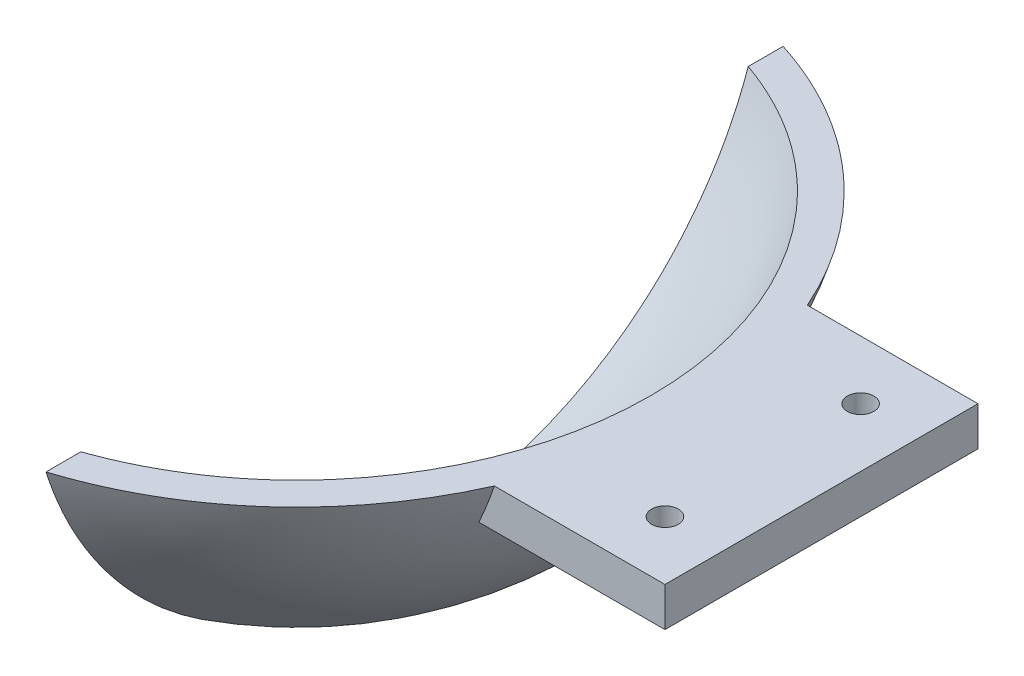
ISO-10303-21;
HEADER;
FILE_DESCRIPTION(('STEP AP214'),'2;1');
FILE_NAME('part.step','',(''),(''),'','','');
FILE_SCHEMA(('AUTOMOTIVE_DESIGN { 1 0 10303 214 1 1 1 1 }'));
ENDSEC;
DATA;
#1=APPLICATION_CONTEXT('core data for automotive mechanical design processes');
#2=APPLICATION_PROTOCOL_DEFINITION('international standard','automotive_design',2000,#1);
#3=PRODUCT_CONTEXT('',#1,'mechanical');
#4=PRODUCT('Part','Part','',(#3));
#5=PRODUCT_RELATED_PRODUCT_CATEGORY('part','',(#4));
#6=PRODUCT_DEFINITION_FORMATION('','',#4);
#7=PRODUCT_DEFINITION_CONTEXT('part definition',#1,'design');
#8=PRODUCT_DEFINITION('design','',#6,#7);
#9=PRODUCT_DEFINITION_SHAPE('','',#8);
#10=(LENGTH_UNIT() NAMED_UNIT(*) SI_UNIT(.MILLI.,.METRE.));
#11=(NAMED_UNIT(*) PLANE_ANGLE_UNIT() SI_UNIT($,.RADIAN.));
#12=(NAMED_UNIT(*) SI_UNIT($,.STERADIAN.) SOLID_ANGLE_UNIT());
#13=UNCERTAINTY_MEASURE_WITH_UNIT(LENGTH_MEASURE(1.E-05),#10,'distance_accuracy_value','');
#14=(GEOMETRIC_REPRESENTATION_CONTEXT(3) GLOBAL_UNCERTAINTY_ASSIGNED_CONTEXT((#13)) GLOBAL_UNIT_ASSIGNED_CONTEXT((#10,
#11,#12)) REPRESENTATION_CONTEXT('',''));
#15=CARTESIAN_POINT('',(0.,0.,0.));
#16=DIRECTION('',(0.,0.,1.));
#17=DIRECTION('',(1.,0.,0.));
#18=AXIS2_PLACEMENT_3D('',#15,#16,#17);
#19=CARTESIAN_POINT('',(52.,-15.,-20.));
#20=DIRECTION('',(0.,-1.,0.));
#21=DIRECTION('',(0.,0.,-1.));
#22=AXIS2_PLACEMENT_3D('',#19,#20,#21);
#23=PLANE('',#22);
#24=CARTESIAN_POINT('',(59.5,-15.,-12.5));
#25=DIRECTION('',(0.,1.,0.));
#26=DIRECTION('',(0.,0.,1.));
#27=AXIS2_PLACEMENT_3D('',#24,#25,#26);
#28=CIRCLE('',#27,1.7);
#29=CARTESIAN_POINT('',(59.5,-15.,-10.8));
#30=VERTEX_POINT('',#29);
#31=EDGE_CURVE('E136',#30,#30,#28,.T.);
#32=ORIENTED_EDGE('',*,*,#31,.F.);
#33=EDGE_LOOP('',(#32));
#34=FACE_BOUND('',#33,.T.);
#35=CARTESIAN_POINT('',(59.5,-15.,12.5));
#36=DIRECTION('',(0.,1.,0.));
#37=DIRECTION('',(0.,0.,1.));
#38=AXIS2_PLACEMENT_3D('',#35,#36,#37);
#39=CIRCLE('',#38,1.7);
#40=CARTESIAN_POINT('',(59.5,-15.,14.2));
#41=VERTEX_POINT('',#40);
#42=EDGE_CURVE('E128',#41,#41,#39,.T.);
#43=ORIENTED_EDGE('',*,*,#42,.F.);
#44=EDGE_LOOP('',(#43));
#45=FACE_BOUND('',#44,.T.);
#46=CARTESIAN_POINT('',(0.,-15.,0.));
#47=DIRECTION('',(0.,-1.,0.));
#48=DIRECTION('',(0.,0.,-1.));
#49=AXIS2_PLACEMENT_3D('',#46,#47,#48);
#50=CIRCLE('',#49,49.423906158862);
#51=CARTESIAN_POINT('',(15.,-15.,-47.0927011329781));
#52=VERTEX_POINT('',#51);
#53=CARTESIAN_POINT('',(45.1964876953951,-15.,-20.));
#54=VERTEX_POINT('',#53);
#55=EDGE_CURVE('E59',#52,#54,#50,.T.);
#56=ORIENTED_EDGE('',*,*,#55,.F.);
#57=DIRECTION('',(0.,0.,1.));
#58=VECTOR('',#57,1.);
#59=CARTESIAN_POINT('',(15.,-15.,-20.));
#60=LINE('',#59,#58);
#61=CARTESIAN_POINT('',(15.,-15.,-42.6396602355131));
#62=VERTEX_POINT('',#61);
#63=EDGE_CURVE('E96',#52,#62,#60,.T.);
#64=ORIENTED_EDGE('',*,*,#63,.T.);
#65=CARTESIAN_POINT('',(0.,-15.,0.));
#66=DIRECTION('',(0.,-1.,0.));
#67=DIRECTION('',(0.,0.,-1.));
#68=AXIS2_PLACEMENT_3D('',#65,#66,#67);
#69=CIRCLE('',#68,45.2011130947016);
#70=CARTESIAN_POINT('',(15.,-15.,42.6396602355131));
#71=VERTEX_POINT('',#70);
#72=EDGE_CURVE('E43',#71,#62,#69,.F.);
#73=ORIENTED_EDGE('',*,*,#72,.F.);
#74=CARTESIAN_POINT('',(15.,-15.,47.0927011329781));
#75=VERTEX_POINT('',#74);
#76=EDGE_CURVE('E50',#71,#75,#60,.T.);
#77=ORIENTED_EDGE('',*,*,#76,.T.);
#78=CARTESIAN_POINT('',(45.1964876953951,-15.,20.));
#79=VERTEX_POINT('',#78);
#80=EDGE_CURVE('E72',#79,#75,#50,.T.);
#81=ORIENTED_EDGE('',*,*,#80,.F.);
#82=DIRECTION('',(-1.,0.,0.));
#83=VECTOR('',#82,1.);
#84=CARTESIAN_POINT('',(52.,-15.,20.));
#85=LINE('',#84,#83);
#86=CARTESIAN_POINT('',(67.,-15.,20.));
#87=VERTEX_POINT('',#86);
#88=EDGE_CURVE('E77',#87,#79,#85,.T.);
#89=ORIENTED_EDGE('',*,*,#88,.F.);
#90=DIRECTION('',(0.,0.,1.));
#91=VECTOR('',#90,1.);
#92=CARTESIAN_POINT('',(67.,-15.,-20.));
#93=LINE('',#92,#91);
#94=CARTESIAN_POINT('',(67.,-15.,-20.));
#95=VERTEX_POINT('',#94);
#96=EDGE_CURVE('E109',#95,#87,#93,.T.);
#97=ORIENTED_EDGE('',*,*,#96,.F.);
#98=DIRECTION('',(-1.,0.,0.));
#99=VECTOR('',#98,1.);
#100=CARTESIAN_POINT('',(52.,-15.,-20.));
#101=LINE('',#100,#99);
#102=EDGE_CURVE('E122',#95,#54,#101,.T.);
#103=ORIENTED_EDGE('',*,*,#102,.T.);
#104=EDGE_LOOP('',(#56,#64,#73,#77,#81,#89,#97,#103));
#105=FACE_BOUND('',#104,.T.);
#106=ADVANCED_FACE('F35',(#34,#45,#105),#23,.F.);
#107=CARTESIAN_POINT('',(52.,-20.,-20.));
#108=DIRECTION('',(0.,-1.,0.));
#109=DIRECTION('',(0.,0.,-1.));
#110=AXIS2_PLACEMENT_3D('',#107,#108,#109);
#111=PLANE('',#110);
#112=CARTESIAN_POINT('',(59.5,-20.,-12.5));
#113=DIRECTION('',(0.,-1.,0.));
#114=DIRECTION('',(0.,0.,-1.));
#115=AXIS2_PLACEMENT_3D('',#112,#113,#114);
#116=CIRCLE('',#115,1.7);
#117=CARTESIAN_POINT('',(59.5,-20.,-14.2));
#118=VERTEX_POINT('',#117);
#119=EDGE_CURVE('E38',#118,#118,#116,.T.);
#120=ORIENTED_EDGE('',*,*,#119,.F.);
#121=EDGE_LOOP('',(#120));
#122=FACE_BOUND('',#121,.T.);
#123=CARTESIAN_POINT('',(59.5,-20.,12.5));
#124=DIRECTION('',(0.,-1.,0.));
#125=DIRECTION('',(0.,0.,-1.));
#126=AXIS2_PLACEMENT_3D('',#123,#124,#125);
#127=CIRCLE('',#126,1.7);
#128=CARTESIAN_POINT('',(59.5,-20.,10.8));
#129=VERTEX_POINT('',#128);
#130=EDGE_CURVE('E126',#129,#129,#127,.T.);
#131=ORIENTED_EDGE('',*,*,#130,.F.);
#132=EDGE_LOOP('',(#131));
#133=FACE_BOUND('',#132,.T.);
#134=CARTESIAN_POINT('',(0.,-20.,0.));
#135=DIRECTION('',(0.,-1.,0.));
#136=DIRECTION('',(0.,0.,-1.));
#137=AXIS2_PLACEMENT_3D('',#134,#135,#136);
#138=CIRCLE('',#137,47.6206100338918);
#139=CARTESIAN_POINT('',(43.217155158571,-20.,-20.));
#140=VERTEX_POINT('',#139);
#141=CARTESIAN_POINT('',(43.217155158571,-20.,20.));
#142=VERTEX_POINT('',#141);
#143=EDGE_CURVE('E104',#140,#142,#138,.T.);
#144=ORIENTED_EDGE('',*,*,#143,.F.);
#145=DIRECTION('',(-1.,0.,0.));
#146=VECTOR('',#145,1.);
#147=CARTESIAN_POINT('',(52.,-20.,-20.));
#148=LINE('',#147,#146);
#149=CARTESIAN_POINT('',(67.,-20.,-20.));
#150=VERTEX_POINT('',#149);
#151=EDGE_CURVE('E114',#150,#140,#148,.T.);
#152=ORIENTED_EDGE('',*,*,#151,.F.);
#153=DIRECTION('',(0.,0.,-1.));
#154=VECTOR('',#153,1.);
#155=CARTESIAN_POINT('',(67.,-20.,20.));
#156=LINE('',#155,#154);
#157=CARTESIAN_POINT('',(67.,-20.,20.));
#158=VERTEX_POINT('',#157);
#159=EDGE_CURVE('E143',#158,#150,#156,.T.);
#160=ORIENTED_EDGE('',*,*,#159,.F.);
#161=DIRECTION('',(-1.,0.,0.));
#162=VECTOR('',#161,1.);
#163=CARTESIAN_POINT('',(52.,-20.,20.));
#164=LINE('',#163,#162);
#165=EDGE_CURVE('E121',#158,#142,#164,.T.);
#166=ORIENTED_EDGE('',*,*,#165,.T.);
#167=EDGE_LOOP('',(#144,#152,#160,#166));
#168=FACE_BOUND('',#167,.T.);
#169=ADVANCED_FACE('F155',(#122,#133,#168),#111,.T.);
#170=CARTESIAN_POINT('',(52.,-20.,-20.));
#171=DIRECTION('',(0.,0.,1.));
#172=DIRECTION('',(0.,-1.,0.));
#173=AXIS2_PLACEMENT_3D('',#170,#171,#172);
#174=PLANE('',#173);
#175=ORIENTED_EDGE('',*,*,#151,.T.);
#176=CARTESIAN_POINT('',(0.,0.,-20.));
#177=DIRECTION('',(0.,0.,1.));
#178=DIRECTION('',(0.,-1.,0.));
#179=AXIS2_PLACEMENT_3D('',#176,#177,#178);
#180=CIRCLE('',#179,47.6206100338918);
#181=EDGE_CURVE('E112',#140,#54,#180,.T.);
#182=ORIENTED_EDGE('',*,*,#181,.T.);
#183=ORIENTED_EDGE('',*,*,#102,.F.);
#184=DIRECTION('',(0.,1.,0.));
#185=VECTOR('',#184,1.);
#186=CARTESIAN_POINT('',(67.,-20.,-20.));
#187=LINE('',#186,#185);
#188=EDGE_CURVE('E145',#150,#95,#187,.T.);
#189=ORIENTED_EDGE('',*,*,#188,.F.);
#190=EDGE_LOOP('',(#175,#182,#183,#189));
#191=FACE_BOUND('',#190,.T.);
#192=ADVANCED_FACE('F157',(#191),#174,.F.);
#193=CARTESIAN_POINT('',(52.,-20.,20.));
#194=DIRECTION('',(0.,0.,1.));
#195=DIRECTION('',(0.,-1.,0.));
#196=AXIS2_PLACEMENT_3D('',#193,#194,#195);
#197=PLANE('',#196);
#198=CARTESIAN_POINT('',(0.,0.,20.));
#199=DIRECTION('',(0.,0.,1.));
#200=DIRECTION('',(0.,-1.,0.));
#201=AXIS2_PLACEMENT_3D('',#198,#199,#200);
#202=CIRCLE('',#201,47.6206100338918);
#203=EDGE_CURVE('E115',#142,#79,#202,.T.);
#204=ORIENTED_EDGE('',*,*,#203,.F.);
#205=ORIENTED_EDGE('',*,*,#165,.F.);
#206=DIRECTION('',(0.,-1.,0.));
#207=VECTOR('',#206,1.);
#208=CARTESIAN_POINT('',(67.,-15.,20.));
#209=LINE('',#208,#207);
#210=EDGE_CURVE('E140',#87,#158,#209,.T.);
#211=ORIENTED_EDGE('',*,*,#210,.F.);
#212=ORIENTED_EDGE('',*,*,#88,.T.);
#213=EDGE_LOOP('',(#204,#205,#211,#212));
#214=FACE_BOUND('',#213,.T.);
#215=ADVANCED_FACE('F152',(#214),#197,.T.);
#216=CARTESIAN_POINT('',(0.,0.,0.));
#217=DIRECTION('',(0.,0.,-1.));
#218=DIRECTION('',(1.,0.,0.));
#219=AXIS2_PLACEMENT_3D('',#216,#217,#218);
#220=SPHERICAL_SURFACE('',#219,51.65);
#221=ORIENTED_EDGE('',*,*,#80,.T.);
#222=CARTESIAN_POINT('',(15.,0.,0.));
#223=DIRECTION('',(1.,0.,0.));
#224=DIRECTION('',(0.,0.,-1.));
#225=AXIS2_PLACEMENT_3D('',#222,#223,#224);
#226=CIRCLE('',#225,49.423906158862);
#227=EDGE_CURVE('E101',#75,#52,#226,.T.);
#228=ORIENTED_EDGE('',*,*,#227,.T.);
#229=ORIENTED_EDGE('',*,*,#55,.T.);
#230=ORIENTED_EDGE('',*,*,#181,.F.);
#231=ORIENTED_EDGE('',*,*,#143,.T.);
#232=ORIENTED_EDGE('',*,*,#203,.T.);
#233=EDGE_LOOP('',(#221,#228,#229,#230,#231,#232));
#234=FACE_BOUND('',#233,.T.);
#235=ADVANCED_FACE('F158',(#234),#220,.T.);
#236=CARTESIAN_POINT('',(0.,0.,0.));
#237=DIRECTION('',(0.,0.,-1.));
#238=DIRECTION('',(1.,0.,0.));
#239=AXIS2_PLACEMENT_3D('',#236,#237,#238);
#240=SPHERICAL_SURFACE('',#239,47.625);
#241=CARTESIAN_POINT('',(15.,0.,0.));
#242=DIRECTION('',(1.,0.,0.));
#243=DIRECTION('',(0.,0.,-1.));
#244=AXIS2_PLACEMENT_3D('',#241,#242,#243);
#245=CIRCLE('',#244,45.2011130947016);
#246=EDGE_CURVE('E11',#71,#62,#245,.T.);
#247=ORIENTED_EDGE('',*,*,#246,.F.);
#248=ORIENTED_EDGE('',*,*,#72,.T.);
#249=EDGE_LOOP('',(#247,#248));
#250=FACE_BOUND('',#249,.T.);
#251=ADVANCED_FACE('F103',(#250),#240,.F.);
#252=CARTESIAN_POINT('',(67.,0.,0.));
#253=DIRECTION('',(1.,0.,0.));
#254=DIRECTION('',(0.,0.,-1.));
#255=AXIS2_PLACEMENT_3D('',#252,#253,#254);
#256=PLANE('',#255);
#257=ORIENTED_EDGE('',*,*,#210,.T.);
#258=ORIENTED_EDGE('',*,*,#159,.T.);
#259=ORIENTED_EDGE('',*,*,#188,.T.);
#260=ORIENTED_EDGE('',*,*,#96,.T.);
#261=EDGE_LOOP('',(#257,#258,#259,#260));
#262=FACE_BOUND('',#261,.T.);
#263=ADVANCED_FACE('F150',(#262),#256,.T.);
#264=CARTESIAN_POINT('',(15.,-51.65,-52.3907180023793));
#265=DIRECTION('',(1.,0.,0.));
#266=DIRECTION('',(0.,0.,-1.));
#267=AXIS2_PLACEMENT_3D('',#264,#265,#266);
#268=PLANE('',#267);
#269=ORIENTED_EDGE('',*,*,#76,.F.);
#270=ORIENTED_EDGE('',*,*,#246,.T.);
#271=ORIENTED_EDGE('',*,*,#63,.F.);
#272=ORIENTED_EDGE('',*,*,#227,.F.);
#273=EDGE_LOOP('',(#269,#270,#271,#272));
#274=FACE_BOUND('',#273,.T.);
#275=ADVANCED_FACE('F95',(#274),#268,.F.);
#276=CARTESIAN_POINT('',(59.5,-49.423906158862,12.5));
#277=DIRECTION('',(0.,1.,0.));
#278=DIRECTION('',(0.,0.,1.));
#279=AXIS2_PLACEMENT_3D('',#276,#277,#278);
#280=CYLINDRICAL_SURFACE('',#279,1.7);
#281=ORIENTED_EDGE('',*,*,#130,.T.);
#282=EDGE_LOOP('',(#281));
#283=FACE_BOUND('',#282,.T.);
#284=ORIENTED_EDGE('',*,*,#42,.T.);
#285=EDGE_LOOP('',(#284));
#286=FACE_BOUND('',#285,.T.);
#287=ADVANCED_FACE('F180',(#283,#286),#280,.F.);
#288=CARTESIAN_POINT('',(59.5,-49.423906158862,-12.5));
#289=DIRECTION('',(0.,1.,0.));
#290=DIRECTION('',(0.,0.,1.));
#291=AXIS2_PLACEMENT_3D('',#288,#289,#290);
#292=CYLINDRICAL_SURFACE('',#291,1.7);
#293=ORIENTED_EDGE('',*,*,#119,.T.);
#294=EDGE_LOOP('',(#293));
#295=FACE_BOUND('',#294,.T.);
#296=ORIENTED_EDGE('',*,*,#31,.T.);
#297=EDGE_LOOP('',(#296));
#298=FACE_BOUND('',#297,.T.);
#299=ADVANCED_FACE('F178',(#295,#298),#292,.F.);
#300=CLOSED_SHELL('',(#106,#169,#192,#215,#235,#251,#263,#275,#287,#299));
#301=MANIFOLD_SOLID_BREP('B2',#300);
#302=ADVANCED_BREP_SHAPE_REPRESENTATION('',(#18,#301),#14);
#303=SHAPE_DEFINITION_REPRESENTATION(#9,#302);
ENDSEC;
END-ISO-10303-21;
